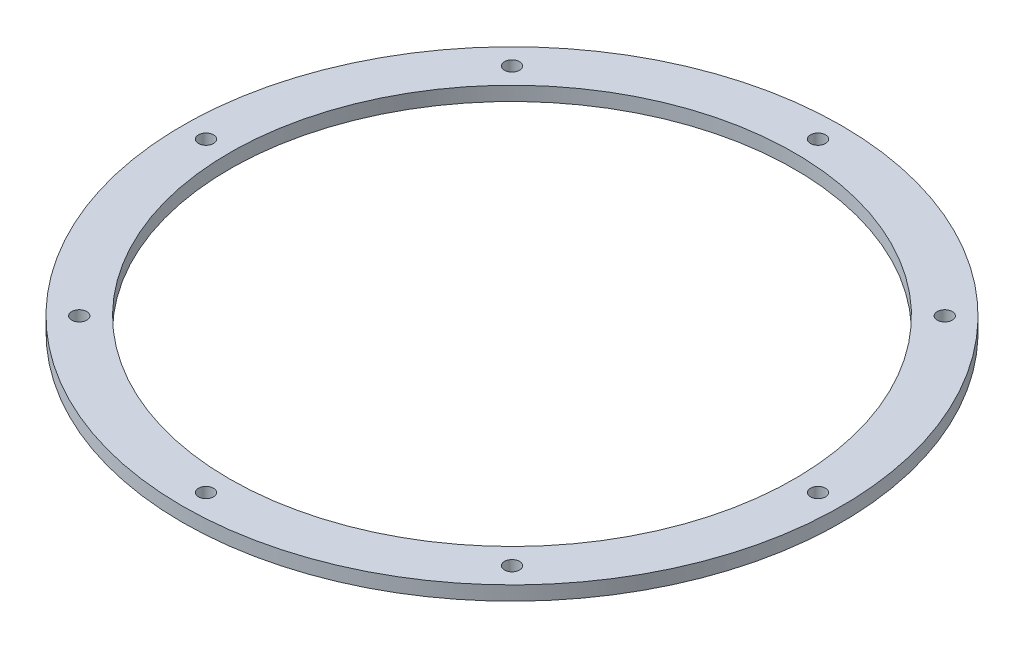
ISO-10303-21;
HEADER;
FILE_DESCRIPTION(('STEP AP214'),'2;1');
FILE_NAME('part.step','',(''),(''),'','','');
FILE_SCHEMA(('AUTOMOTIVE_DESIGN { 1 0 10303 214 1 1 1 1 }'));
ENDSEC;
DATA;
#1=APPLICATION_CONTEXT('core data for automotive mechanical design processes');
#2=APPLICATION_PROTOCOL_DEFINITION('international standard','automotive_design',2000,#1);
#3=PRODUCT_CONTEXT('',#1,'mechanical');
#4=PRODUCT('Part','Part','',(#3));
#5=PRODUCT_RELATED_PRODUCT_CATEGORY('part','',(#4));
#6=PRODUCT_DEFINITION_FORMATION('','',#4);
#7=PRODUCT_DEFINITION_CONTEXT('part definition',#1,'design');
#8=PRODUCT_DEFINITION('design','',#6,#7);
#9=PRODUCT_DEFINITION_SHAPE('','',#8);
#10=(LENGTH_UNIT() NAMED_UNIT(*) SI_UNIT(.MILLI.,.METRE.));
#11=(NAMED_UNIT(*) PLANE_ANGLE_UNIT() SI_UNIT($,.RADIAN.));
#12=(NAMED_UNIT(*) SI_UNIT($,.STERADIAN.) SOLID_ANGLE_UNIT());
#13=UNCERTAINTY_MEASURE_WITH_UNIT(LENGTH_MEASURE(1.E-05),#10,'distance_accuracy_value','');
#14=(GEOMETRIC_REPRESENTATION_CONTEXT(3) GLOBAL_UNCERTAINTY_ASSIGNED_CONTEXT((#13)) GLOBAL_UNIT_ASSIGNED_CONTEXT((#10,
#11,#12)) REPRESENTATION_CONTEXT('',''));
#15=CARTESIAN_POINT('',(0.,0.,0.));
#16=DIRECTION('',(0.,0.,1.));
#17=DIRECTION('',(1.,0.,0.));
#18=AXIS2_PLACEMENT_3D('',#15,#16,#17);
#19=CARTESIAN_POINT('',(0.,3.,0.));
#20=DIRECTION('',(0.,1.,0.));
#21=DIRECTION('',(0.,0.,1.));
#22=AXIS2_PLACEMENT_3D('',#19,#20,#21);
#23=PLANE('',#22);
#24=CARTESIAN_POINT('',(-65.,3.,-6.80838861074411E-13));
#25=DIRECTION('',(0.,1.,0.));
#26=DIRECTION('',(0.,0.,1.));
#27=AXIS2_PLACEMENT_3D('',#24,#25,#26);
#28=CIRCLE('',#27,1.6);
#29=CARTESIAN_POINT('',(-65.,3.,1.59999999999932));
#30=VERTEX_POINT('',#29);
#31=EDGE_CURVE('E88',#30,#30,#28,.T.);
#32=ORIENTED_EDGE('',*,*,#31,.F.);
#33=EDGE_LOOP('',(#32));
#34=FACE_BOUND('',#33,.T.);
#35=CARTESIAN_POINT('',(-4.53892574049607E-13,3.,65.));
#36=DIRECTION('',(0.,1.,0.));
#37=DIRECTION('',(0.,0.,1.));
#38=AXIS2_PLACEMENT_3D('',#35,#36,#37);
#39=CIRCLE('',#38,1.6);
#40=CARTESIAN_POINT('',(-4.53892574049607E-13,3.,66.6));
#41=VERTEX_POINT('',#40);
#42=EDGE_CURVE('E76',#41,#41,#39,.T.);
#43=ORIENTED_EDGE('',*,*,#42,.F.);
#44=EDGE_LOOP('',(#43));
#45=FACE_BOUND('',#44,.T.);
#46=CARTESIAN_POINT('',(65.,3.,2.26946287024804E-13));
#47=DIRECTION('',(0.,1.,0.));
#48=DIRECTION('',(0.,0.,1.));
#49=AXIS2_PLACEMENT_3D('',#46,#47,#48);
#50=CIRCLE('',#49,1.6);
#51=CARTESIAN_POINT('',(65.,3.,1.60000000000023));
#52=VERTEX_POINT('',#51);
#53=EDGE_CURVE('E64',#52,#52,#50,.T.);
#54=ORIENTED_EDGE('',*,*,#53,.F.);
#55=EDGE_LOOP('',(#54));
#56=FACE_BOUND('',#55,.T.);
#57=CARTESIAN_POINT('',(0.,3.,-65.));
#58=DIRECTION('',(0.,1.,0.));
#59=DIRECTION('',(0.,0.,1.));
#60=AXIS2_PLACEMENT_3D('',#57,#58,#59);
#61=CIRCLE('',#60,1.6);
#62=CARTESIAN_POINT('',(0.,3.,-63.4));
#63=VERTEX_POINT('',#62);
#64=EDGE_CURVE('E52',#63,#63,#61,.T.);
#65=ORIENTED_EDGE('',*,*,#64,.F.);
#66=EDGE_LOOP('',(#65));
#67=FACE_BOUND('',#66,.T.);
#68=CARTESIAN_POINT('',(0.,3.,0.));
#69=DIRECTION('',(0.,1.,0.));
#70=DIRECTION('',(0.,0.,1.));
#71=AXIS2_PLACEMENT_3D('',#68,#69,#70);
#72=CIRCLE('',#71,70.);
#73=CARTESIAN_POINT('',(0.,3.,70.));
#74=VERTEX_POINT('',#73);
#75=EDGE_CURVE('E10',#74,#74,#72,.T.);
#76=ORIENTED_EDGE('',*,*,#75,.T.);
#77=EDGE_LOOP('',(#76));
#78=FACE_BOUND('',#77,.T.);
#79=CARTESIAN_POINT('',(0.,3.,0.));
#80=DIRECTION('',(0.,1.,0.));
#81=DIRECTION('',(0.,0.,1.));
#82=AXIS2_PLACEMENT_3D('',#79,#80,#81);
#83=CIRCLE('',#82,60.);
#84=CARTESIAN_POINT('',(0.,3.,60.));
#85=VERTEX_POINT('',#84);
#86=EDGE_CURVE('E47',#85,#85,#83,.T.);
#87=ORIENTED_EDGE('',*,*,#86,.F.);
#88=EDGE_LOOP('',(#87));
#89=FACE_BOUND('',#88,.T.);
#90=CARTESIAN_POINT('',(45.9619407771257,3.,-45.9619407771255));
#91=DIRECTION('',(0.,1.,0.));
#92=DIRECTION('',(0.,0.,1.));
#93=AXIS2_PLACEMENT_3D('',#90,#91,#92);
#94=CIRCLE('',#93,1.6);
#95=CARTESIAN_POINT('',(45.9619407771257,3.,-44.3619407771255));
#96=VERTEX_POINT('',#95);
#97=EDGE_CURVE('E58',#96,#96,#94,.T.);
#98=ORIENTED_EDGE('',*,*,#97,.F.);
#99=EDGE_LOOP('',(#98));
#100=FACE_BOUND('',#99,.T.);
#101=CARTESIAN_POINT('',(45.9619407771253,3.,45.9619407771258));
#102=DIRECTION('',(0.,1.,0.));
#103=DIRECTION('',(0.,0.,1.));
#104=AXIS2_PLACEMENT_3D('',#101,#102,#103);
#105=CIRCLE('',#104,1.6);
#106=CARTESIAN_POINT('',(45.9619407771253,3.,47.5619407771258));
#107=VERTEX_POINT('',#106);
#108=EDGE_CURVE('E70',#107,#107,#105,.T.);
#109=ORIENTED_EDGE('',*,*,#108,.F.);
#110=EDGE_LOOP('',(#109));
#111=FACE_BOUND('',#110,.T.);
#112=CARTESIAN_POINT('',(-45.961940777126,3.,45.9619407771252));
#113=DIRECTION('',(0.,1.,0.));
#114=DIRECTION('',(0.,0.,1.));
#115=AXIS2_PLACEMENT_3D('',#112,#113,#114);
#116=CIRCLE('',#115,1.6);
#117=CARTESIAN_POINT('',(-45.961940777126,3.,47.5619407771252));
#118=VERTEX_POINT('',#117);
#119=EDGE_CURVE('E82',#118,#118,#116,.T.);
#120=ORIENTED_EDGE('',*,*,#119,.F.);
#121=EDGE_LOOP('',(#120));
#122=FACE_BOUND('',#121,.T.);
#123=CARTESIAN_POINT('',(-45.961940777125,3.,-45.9619407771261));
#124=DIRECTION('',(0.,1.,0.));
#125=DIRECTION('',(0.,0.,1.));
#126=AXIS2_PLACEMENT_3D('',#123,#124,#125);
#127=CIRCLE('',#126,1.6);
#128=CARTESIAN_POINT('',(-45.961940777125,3.,-44.3619407771261));
#129=VERTEX_POINT('',#128);
#130=EDGE_CURVE('E94',#129,#129,#127,.T.);
#131=ORIENTED_EDGE('',*,*,#130,.F.);
#132=EDGE_LOOP('',(#131));
#133=FACE_BOUND('',#132,.T.);
#134=ADVANCED_FACE('F36',(#34,#45,#56,#67,#78,#89,#100,#111,#122,#133),#23,.T.);
#135=CARTESIAN_POINT('',(0.,0.,0.));
#136=DIRECTION('',(0.,1.,0.));
#137=DIRECTION('',(0.,0.,1.));
#138=AXIS2_PLACEMENT_3D('',#135,#136,#137);
#139=PLANE('',#138);
#140=CARTESIAN_POINT('',(0.,0.,0.));
#141=DIRECTION('',(0.,1.,0.));
#142=DIRECTION('',(0.,0.,1.));
#143=AXIS2_PLACEMENT_3D('',#140,#141,#142);
#144=CIRCLE('',#143,70.);
#145=CARTESIAN_POINT('',(0.,0.,70.));
#146=VERTEX_POINT('',#145);
#147=EDGE_CURVE('E40',#146,#146,#144,.T.);
#148=ORIENTED_EDGE('',*,*,#147,.F.);
#149=EDGE_LOOP('',(#148));
#150=FACE_BOUND('',#149,.T.);
#151=CARTESIAN_POINT('',(0.,0.,0.));
#152=DIRECTION('',(0.,1.,0.));
#153=DIRECTION('',(0.,0.,1.));
#154=AXIS2_PLACEMENT_3D('',#151,#152,#153);
#155=CIRCLE('',#154,60.);
#156=CARTESIAN_POINT('',(0.,0.,60.));
#157=VERTEX_POINT('',#156);
#158=EDGE_CURVE('E49',#157,#157,#155,.T.);
#159=ORIENTED_EDGE('',*,*,#158,.T.);
#160=EDGE_LOOP('',(#159));
#161=FACE_BOUND('',#160,.T.);
#162=CARTESIAN_POINT('',(0.,0.,-65.));
#163=DIRECTION('',(0.,1.,0.));
#164=DIRECTION('',(0.,0.,1.));
#165=AXIS2_PLACEMENT_3D('',#162,#163,#164);
#166=CIRCLE('',#165,1.6);
#167=CARTESIAN_POINT('',(0.,0.,-63.4));
#168=VERTEX_POINT('',#167);
#169=EDGE_CURVE('E55',#168,#168,#166,.T.);
#170=ORIENTED_EDGE('',*,*,#169,.T.);
#171=EDGE_LOOP('',(#170));
#172=FACE_BOUND('',#171,.T.);
#173=CARTESIAN_POINT('',(45.9619407771257,0.,-45.9619407771255));
#174=DIRECTION('',(0.,1.,0.));
#175=DIRECTION('',(0.,0.,1.));
#176=AXIS2_PLACEMENT_3D('',#173,#174,#175);
#177=CIRCLE('',#176,1.6);
#178=CARTESIAN_POINT('',(45.9619407771257,0.,-44.3619407771255));
#179=VERTEX_POINT('',#178);
#180=EDGE_CURVE('E61',#179,#179,#177,.T.);
#181=ORIENTED_EDGE('',*,*,#180,.T.);
#182=EDGE_LOOP('',(#181));
#183=FACE_BOUND('',#182,.T.);
#184=CARTESIAN_POINT('',(65.,0.,2.26946287024804E-13));
#185=DIRECTION('',(0.,1.,0.));
#186=DIRECTION('',(0.,0.,1.));
#187=AXIS2_PLACEMENT_3D('',#184,#185,#186);
#188=CIRCLE('',#187,1.6);
#189=CARTESIAN_POINT('',(65.,0.,1.60000000000023));
#190=VERTEX_POINT('',#189);
#191=EDGE_CURVE('E67',#190,#190,#188,.T.);
#192=ORIENTED_EDGE('',*,*,#191,.T.);
#193=EDGE_LOOP('',(#192));
#194=FACE_BOUND('',#193,.T.);
#195=CARTESIAN_POINT('',(45.9619407771253,0.,45.9619407771258));
#196=DIRECTION('',(0.,1.,0.));
#197=DIRECTION('',(0.,0.,1.));
#198=AXIS2_PLACEMENT_3D('',#195,#196,#197);
#199=CIRCLE('',#198,1.6);
#200=CARTESIAN_POINT('',(45.9619407771253,0.,47.5619407771258));
#201=VERTEX_POINT('',#200);
#202=EDGE_CURVE('E73',#201,#201,#199,.T.);
#203=ORIENTED_EDGE('',*,*,#202,.T.);
#204=EDGE_LOOP('',(#203));
#205=FACE_BOUND('',#204,.T.);
#206=CARTESIAN_POINT('',(-4.53892574049607E-13,0.,65.));
#207=DIRECTION('',(0.,1.,0.));
#208=DIRECTION('',(0.,0.,1.));
#209=AXIS2_PLACEMENT_3D('',#206,#207,#208);
#210=CIRCLE('',#209,1.6);
#211=CARTESIAN_POINT('',(-4.53892574049607E-13,0.,66.6));
#212=VERTEX_POINT('',#211);
#213=EDGE_CURVE('E79',#212,#212,#210,.T.);
#214=ORIENTED_EDGE('',*,*,#213,.T.);
#215=EDGE_LOOP('',(#214));
#216=FACE_BOUND('',#215,.T.);
#217=CARTESIAN_POINT('',(-45.961940777126,0.,45.9619407771252));
#218=DIRECTION('',(0.,1.,0.));
#219=DIRECTION('',(0.,0.,1.));
#220=AXIS2_PLACEMENT_3D('',#217,#218,#219);
#221=CIRCLE('',#220,1.6);
#222=CARTESIAN_POINT('',(-45.961940777126,0.,47.5619407771252));
#223=VERTEX_POINT('',#222);
#224=EDGE_CURVE('E85',#223,#223,#221,.T.);
#225=ORIENTED_EDGE('',*,*,#224,.T.);
#226=EDGE_LOOP('',(#225));
#227=FACE_BOUND('',#226,.T.);
#228=CARTESIAN_POINT('',(-65.,0.,-6.80838861074411E-13));
#229=DIRECTION('',(0.,1.,0.));
#230=DIRECTION('',(0.,0.,1.));
#231=AXIS2_PLACEMENT_3D('',#228,#229,#230);
#232=CIRCLE('',#231,1.6);
#233=CARTESIAN_POINT('',(-65.,0.,1.59999999999932));
#234=VERTEX_POINT('',#233);
#235=EDGE_CURVE('E91',#234,#234,#232,.T.);
#236=ORIENTED_EDGE('',*,*,#235,.T.);
#237=EDGE_LOOP('',(#236));
#238=FACE_BOUND('',#237,.T.);
#239=CARTESIAN_POINT('',(-45.961940777125,0.,-45.9619407771261));
#240=DIRECTION('',(0.,1.,0.));
#241=DIRECTION('',(0.,0.,1.));
#242=AXIS2_PLACEMENT_3D('',#239,#240,#241);
#243=CIRCLE('',#242,1.6);
#244=CARTESIAN_POINT('',(-45.961940777125,0.,-44.3619407771261));
#245=VERTEX_POINT('',#244);
#246=EDGE_CURVE('E97',#245,#245,#243,.T.);
#247=ORIENTED_EDGE('',*,*,#246,.T.);
#248=EDGE_LOOP('',(#247));
#249=FACE_BOUND('',#248,.T.);
#250=ADVANCED_FACE('F107',(#150,#161,#172,#183,#194,#205,#216,#227,#238,#249),#139,.F.);
#251=CARTESIAN_POINT('',(0.,3.,0.));
#252=DIRECTION('',(0.,-1.,0.));
#253=DIRECTION('',(0.,0.,-1.));
#254=AXIS2_PLACEMENT_3D('',#251,#252,#253);
#255=CYLINDRICAL_SURFACE('',#254,70.);
#256=ORIENTED_EDGE('',*,*,#75,.F.);
#257=EDGE_LOOP('',(#256));
#258=FACE_BOUND('',#257,.T.);
#259=ORIENTED_EDGE('',*,*,#147,.T.);
#260=EDGE_LOOP('',(#259));
#261=FACE_BOUND('',#260,.T.);
#262=ADVANCED_FACE('F38',(#258,#261),#255,.T.);
#263=CARTESIAN_POINT('',(0.,3.,0.));
#264=DIRECTION('',(0.,-1.,0.));
#265=DIRECTION('',(0.,0.,-1.));
#266=AXIS2_PLACEMENT_3D('',#263,#264,#265);
#267=CYLINDRICAL_SURFACE('',#266,60.);
#268=ORIENTED_EDGE('',*,*,#86,.T.);
#269=EDGE_LOOP('',(#268));
#270=FACE_BOUND('',#269,.T.);
#271=ORIENTED_EDGE('',*,*,#158,.F.);
#272=EDGE_LOOP('',(#271));
#273=FACE_BOUND('',#272,.T.);
#274=ADVANCED_FACE('F117',(#270,#273),#267,.F.);
#275=CARTESIAN_POINT('',(0.,3.,-65.));
#276=DIRECTION('',(0.,-1.,0.));
#277=DIRECTION('',(0.,0.,-1.));
#278=AXIS2_PLACEMENT_3D('',#275,#276,#277);
#279=CYLINDRICAL_SURFACE('',#278,1.6);
#280=ORIENTED_EDGE('',*,*,#64,.T.);
#281=EDGE_LOOP('',(#280));
#282=FACE_BOUND('',#281,.T.);
#283=ORIENTED_EDGE('',*,*,#169,.F.);
#284=EDGE_LOOP('',(#283));
#285=FACE_BOUND('',#284,.T.);
#286=ADVANCED_FACE('F120',(#282,#285),#279,.F.);
#287=CARTESIAN_POINT('',(45.9619407771257,3.,-45.9619407771255));
#288=DIRECTION('',(0.,-1.,0.));
#289=DIRECTION('',(0.,0.,-1.));
#290=AXIS2_PLACEMENT_3D('',#287,#288,#289);
#291=CYLINDRICAL_SURFACE('',#290,1.6);
#292=ORIENTED_EDGE('',*,*,#97,.T.);
#293=EDGE_LOOP('',(#292));
#294=FACE_BOUND('',#293,.T.);
#295=ORIENTED_EDGE('',*,*,#180,.F.);
#296=EDGE_LOOP('',(#295));
#297=FACE_BOUND('',#296,.T.);
#298=ADVANCED_FACE('F124',(#294,#297),#291,.F.);
#299=CARTESIAN_POINT('',(65.,3.,2.26946287024804E-13));
#300=DIRECTION('',(0.,-1.,0.));
#301=DIRECTION('',(0.,0.,-1.));
#302=AXIS2_PLACEMENT_3D('',#299,#300,#301);
#303=CYLINDRICAL_SURFACE('',#302,1.6);
#304=ORIENTED_EDGE('',*,*,#53,.T.);
#305=EDGE_LOOP('',(#304));
#306=FACE_BOUND('',#305,.T.);
#307=ORIENTED_EDGE('',*,*,#191,.F.);
#308=EDGE_LOOP('',(#307));
#309=FACE_BOUND('',#308,.T.);
#310=ADVANCED_FACE('F128',(#306,#309),#303,.F.);
#311=CARTESIAN_POINT('',(45.9619407771253,3.,45.9619407771258));
#312=DIRECTION('',(0.,-1.,0.));
#313=DIRECTION('',(0.,0.,-1.));
#314=AXIS2_PLACEMENT_3D('',#311,#312,#313);
#315=CYLINDRICAL_SURFACE('',#314,1.6);
#316=ORIENTED_EDGE('',*,*,#108,.T.);
#317=EDGE_LOOP('',(#316));
#318=FACE_BOUND('',#317,.T.);
#319=ORIENTED_EDGE('',*,*,#202,.F.);
#320=EDGE_LOOP('',(#319));
#321=FACE_BOUND('',#320,.T.);
#322=ADVANCED_FACE('F132',(#318,#321),#315,.F.);
#323=CARTESIAN_POINT('',(-4.53892574049607E-13,3.,65.));
#324=DIRECTION('',(0.,-1.,0.));
#325=DIRECTION('',(0.,0.,-1.));
#326=AXIS2_PLACEMENT_3D('',#323,#324,#325);
#327=CYLINDRICAL_SURFACE('',#326,1.6);
#328=ORIENTED_EDGE('',*,*,#42,.T.);
#329=EDGE_LOOP('',(#328));
#330=FACE_BOUND('',#329,.T.);
#331=ORIENTED_EDGE('',*,*,#213,.F.);
#332=EDGE_LOOP('',(#331));
#333=FACE_BOUND('',#332,.T.);
#334=ADVANCED_FACE('F136',(#330,#333),#327,.F.);
#335=CARTESIAN_POINT('',(-45.961940777126,3.,45.9619407771252));
#336=DIRECTION('',(0.,-1.,0.));
#337=DIRECTION('',(0.,0.,-1.));
#338=AXIS2_PLACEMENT_3D('',#335,#336,#337);
#339=CYLINDRICAL_SURFACE('',#338,1.6);
#340=ORIENTED_EDGE('',*,*,#119,.T.);
#341=EDGE_LOOP('',(#340));
#342=FACE_BOUND('',#341,.T.);
#343=ORIENTED_EDGE('',*,*,#224,.F.);
#344=EDGE_LOOP('',(#343));
#345=FACE_BOUND('',#344,.T.);
#346=ADVANCED_FACE('F140',(#342,#345),#339,.F.);
#347=CARTESIAN_POINT('',(-65.,3.,-6.80838861074411E-13));
#348=DIRECTION('',(0.,-1.,0.));
#349=DIRECTION('',(0.,0.,-1.));
#350=AXIS2_PLACEMENT_3D('',#347,#348,#349);
#351=CYLINDRICAL_SURFACE('',#350,1.6);
#352=ORIENTED_EDGE('',*,*,#31,.T.);
#353=EDGE_LOOP('',(#352));
#354=FACE_BOUND('',#353,.T.);
#355=ORIENTED_EDGE('',*,*,#235,.F.);
#356=EDGE_LOOP('',(#355));
#357=FACE_BOUND('',#356,.T.);
#358=ADVANCED_FACE('F144',(#354,#357),#351,.F.);
#359=CARTESIAN_POINT('',(-45.961940777125,3.,-45.9619407771261));
#360=DIRECTION('',(0.,-1.,0.));
#361=DIRECTION('',(0.,0.,-1.));
#362=AXIS2_PLACEMENT_3D('',#359,#360,#361);
#363=CYLINDRICAL_SURFACE('',#362,1.6);
#364=ORIENTED_EDGE('',*,*,#130,.T.);
#365=EDGE_LOOP('',(#364));
#366=FACE_BOUND('',#365,.T.);
#367=ORIENTED_EDGE('',*,*,#246,.F.);
#368=EDGE_LOOP('',(#367));
#369=FACE_BOUND('',#368,.T.);
#370=ADVANCED_FACE('F103',(#366,#369),#363,.F.);
#371=CLOSED_SHELL('',(#134,#250,#262,#274,#286,#298,#310,#322,#334,#346,#358,#370));
#372=MANIFOLD_SOLID_BREP('B2',#371);
#373=ADVANCED_BREP_SHAPE_REPRESENTATION('',(#18,#372),#14);
#374=SHAPE_DEFINITION_REPRESENTATION(#9,#373);
ENDSEC;
END-ISO-10303-21;
